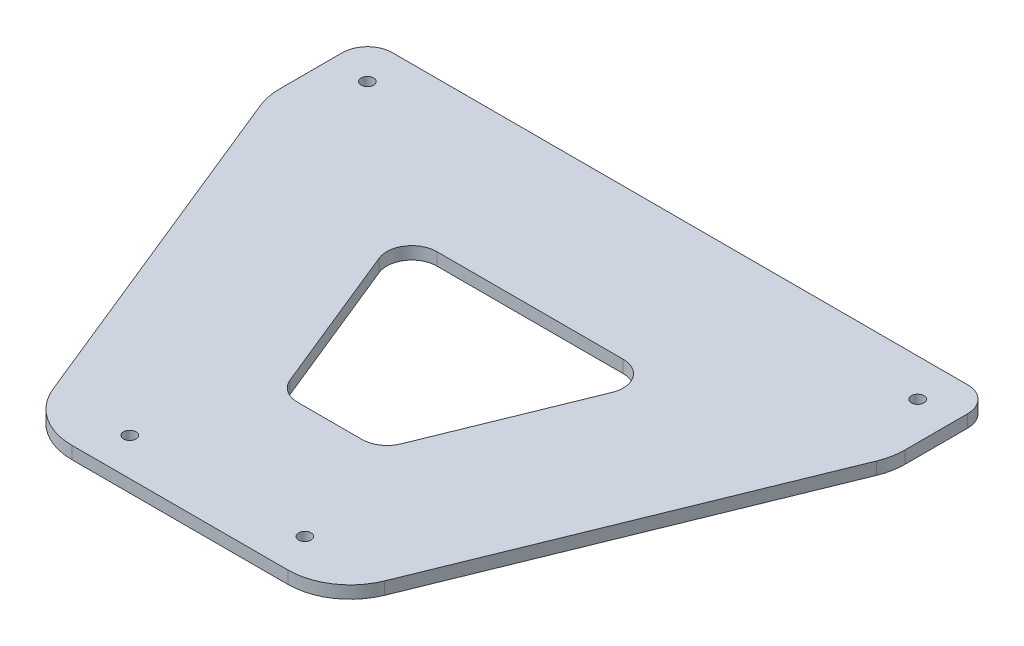
ISO-10303-21;
HEADER;
FILE_DESCRIPTION(('STEP AP214'),'2;1');
FILE_NAME('part.step','',(''),(''),'','','');
FILE_SCHEMA(('AUTOMOTIVE_DESIGN { 1 0 10303 214 1 1 1 1 }'));
ENDSEC;
DATA;
#1=APPLICATION_CONTEXT('core data for automotive mechanical design processes');
#2=APPLICATION_PROTOCOL_DEFINITION('international standard','automotive_design',2000,#1);
#3=PRODUCT_CONTEXT('',#1,'mechanical');
#4=PRODUCT('Part','Part','',(#3));
#5=PRODUCT_RELATED_PRODUCT_CATEGORY('part','',(#4));
#6=PRODUCT_DEFINITION_FORMATION('','',#4);
#7=PRODUCT_DEFINITION_CONTEXT('part definition',#1,'design');
#8=PRODUCT_DEFINITION('design','',#6,#7);
#9=PRODUCT_DEFINITION_SHAPE('','',#8);
#10=(LENGTH_UNIT() NAMED_UNIT(*) SI_UNIT(.MILLI.,.METRE.));
#11=(NAMED_UNIT(*) PLANE_ANGLE_UNIT() SI_UNIT($,.RADIAN.));
#12=(NAMED_UNIT(*) SI_UNIT($,.STERADIAN.) SOLID_ANGLE_UNIT());
#13=UNCERTAINTY_MEASURE_WITH_UNIT(LENGTH_MEASURE(1.E-05),#10,'distance_accuracy_value','');
#14=(GEOMETRIC_REPRESENTATION_CONTEXT(3) GLOBAL_UNCERTAINTY_ASSIGNED_CONTEXT((#13)) GLOBAL_UNIT_ASSIGNED_CONTEXT((#10,
#11,#12)) REPRESENTATION_CONTEXT('',''));
#15=CARTESIAN_POINT('',(0.,0.,0.));
#16=DIRECTION('',(0.,0.,1.));
#17=DIRECTION('',(1.,0.,0.));
#18=AXIS2_PLACEMENT_3D('',#15,#16,#17);
#19=CARTESIAN_POINT('',(-75.,5.,-64.8842924583482));
#20=DIRECTION('',(0.,-1.,0.));
#21=DIRECTION('',(0.,0.,-1.));
#22=AXIS2_PLACEMENT_3D('',#19,#20,#21);
#23=CYLINDRICAL_SURFACE('',#22,25.);
#24=CARTESIAN_POINT('',(-75.,0.,-64.8842924583482));
#25=DIRECTION('',(0.,1.,0.));
#26=DIRECTION('',(0.,0.,1.));
#27=AXIS2_PLACEMENT_3D('',#24,#25,#26);
#28=CIRCLE('',#27,25.);
#29=CARTESIAN_POINT('',(-100.,0.,-64.8842924583483));
#30=VERTEX_POINT('',#29);
#31=CARTESIAN_POINT('',(-98.1616644280577,0.,-55.4748662844496));
#32=VERTEX_POINT('',#31);
#33=EDGE_CURVE('E245',#30,#32,#28,.T.);
#34=ORIENTED_EDGE('',*,*,#33,.T.);
#35=DIRECTION('',(0.,-1.,0.));
#36=VECTOR('',#35,1.);
#37=CARTESIAN_POINT('',(-98.1616644280577,5.,-55.4748662844496));
#38=LINE('',#37,#36);
#39=CARTESIAN_POINT('',(-98.1616644280577,5.,-55.4748662844496));
#40=VERTEX_POINT('',#39);
#41=EDGE_CURVE('E390',#40,#32,#38,.T.);
#42=ORIENTED_EDGE('',*,*,#41,.F.);
#43=CARTESIAN_POINT('',(-75.,5.,-64.8842924583482));
#44=DIRECTION('',(0.,1.,0.));
#45=DIRECTION('',(0.,0.,1.));
#46=AXIS2_PLACEMENT_3D('',#43,#44,#45);
#47=CIRCLE('',#46,25.);
#48=CARTESIAN_POINT('',(-100.,5.,-64.8842924583483));
#49=VERTEX_POINT('',#48);
#50=EDGE_CURVE('E273',#49,#40,#47,.T.);
#51=ORIENTED_EDGE('',*,*,#50,.F.);
#52=DIRECTION('',(0.,-1.,0.));
#53=VECTOR('',#52,1.);
#54=CARTESIAN_POINT('',(-100.,5.,-64.8842924583483));
#55=LINE('',#54,#53);
#56=EDGE_CURVE('E311',#49,#30,#55,.T.);
#57=ORIENTED_EDGE('',*,*,#56,.T.);
#58=EDGE_LOOP('',(#34,#42,#51,#57));
#59=FACE_BOUND('',#58,.T.);
#60=ADVANCED_FACE('F39',(#59),#23,.T.);
#61=CARTESIAN_POINT('',(-41.3336706168538,5.,84.4094261738983));
#62=DIRECTION('',(0.926466577122309,0.,-0.376377046955938));
#63=DIRECTION('',(-0.376377046955938,0.,-0.926466577122309));
#64=AXIS2_PLACEMENT_3D('',#61,#62,#63);
#65=PLANE('',#64);
#66=DIRECTION('',(0.376377046955938,0.,0.926466577122309));
#67=VECTOR('',#66,1.);
#68=CARTESIAN_POINT('',(-41.3336706168538,0.,84.4094261738983));
#69=LINE('',#68,#67);
#70=CARTESIAN_POINT('',(-41.3336706168538,0.,84.4094261738984));
#71=VERTEX_POINT('',#70);
#72=EDGE_CURVE('E315',#32,#71,#69,.T.);
#73=ORIENTED_EDGE('',*,*,#72,.T.);
#74=DIRECTION('',(0.,-1.,0.));
#75=VECTOR('',#74,1.);
#76=CARTESIAN_POINT('',(-41.3336706168538,5.,84.4094261738984));
#77=LINE('',#76,#75);
#78=CARTESIAN_POINT('',(-41.3336706168538,5.,84.4094261738984));
#79=VERTEX_POINT('',#78);
#80=EDGE_CURVE('E386',#79,#71,#77,.T.);
#81=ORIENTED_EDGE('',*,*,#80,.F.);
#82=DIRECTION('',(0.376377046955938,0.,0.926466577122309));
#83=VECTOR('',#82,1.);
#84=CARTESIAN_POINT('',(-41.3336706168538,5.,84.4094261738983));
#85=LINE('',#84,#83);
#86=EDGE_CURVE('E277',#40,#79,#85,.T.);
#87=ORIENTED_EDGE('',*,*,#86,.F.);
#88=ORIENTED_EDGE('',*,*,#41,.T.);
#89=EDGE_LOOP('',(#73,#81,#87,#88));
#90=FACE_BOUND('',#89,.T.);
#91=ADVANCED_FACE('F452',(#90),#65,.F.);
#92=CARTESIAN_POINT('',(-18.1720061887961,5.,75.));
#93=DIRECTION('',(0.,-1.,0.));
#94=DIRECTION('',(0.,0.,-1.));
#95=AXIS2_PLACEMENT_3D('',#92,#93,#94);
#96=CYLINDRICAL_SURFACE('',#95,25.);
#97=CARTESIAN_POINT('',(-18.1720061887961,0.,75.));
#98=DIRECTION('',(0.,1.,0.));
#99=DIRECTION('',(0.,0.,-1.));
#100=AXIS2_PLACEMENT_3D('',#97,#98,#99);
#101=CIRCLE('',#100,25.);
#102=CARTESIAN_POINT('',(-18.1720061887959,0.,100.));
#103=VERTEX_POINT('',#102);
#104=EDGE_CURVE('E318',#71,#103,#101,.T.);
#105=ORIENTED_EDGE('',*,*,#104,.T.);
#106=DIRECTION('',(0.,-1.,0.));
#107=VECTOR('',#106,1.);
#108=CARTESIAN_POINT('',(-18.1720061887959,5.,100.));
#109=LINE('',#108,#107);
#110=CARTESIAN_POINT('',(-18.1720061887959,5.,100.));
#111=VERTEX_POINT('',#110);
#112=EDGE_CURVE('E382',#111,#103,#109,.T.);
#113=ORIENTED_EDGE('',*,*,#112,.F.);
#114=CARTESIAN_POINT('',(-18.1720061887961,5.,75.));
#115=DIRECTION('',(0.,1.,0.));
#116=DIRECTION('',(0.,0.,-1.));
#117=AXIS2_PLACEMENT_3D('',#114,#115,#116);
#118=CIRCLE('',#117,25.);
#119=EDGE_CURVE('E281',#79,#111,#118,.T.);
#120=ORIENTED_EDGE('',*,*,#119,.F.);
#121=ORIENTED_EDGE('',*,*,#80,.T.);
#122=EDGE_LOOP('',(#105,#113,#120,#121));
#123=FACE_BOUND('',#122,.T.);
#124=ADVANCED_FACE('F457',(#123),#96,.T.);
#125=CARTESIAN_POINT('',(68.1720061887959,5.,100.));
#126=DIRECTION('',(0.,0.,-1.));
#127=DIRECTION('',(-1.,0.,0.));
#128=AXIS2_PLACEMENT_3D('',#125,#126,#127);
#129=PLANE('',#128);
#130=DIRECTION('',(1.,0.,0.));
#131=VECTOR('',#130,1.);
#132=CARTESIAN_POINT('',(68.1720061887959,0.,100.));
#133=LINE('',#132,#131);
#134=CARTESIAN_POINT('',(68.1720061887959,0.,100.));
#135=VERTEX_POINT('',#134);
#136=EDGE_CURVE('E321',#103,#135,#133,.T.);
#137=ORIENTED_EDGE('',*,*,#136,.T.);
#138=DIRECTION('',(0.,-1.,0.));
#139=VECTOR('',#138,1.);
#140=CARTESIAN_POINT('',(68.1720061887959,5.,100.));
#141=LINE('',#140,#139);
#142=CARTESIAN_POINT('',(68.1720061887959,5.,100.));
#143=VERTEX_POINT('',#142);
#144=EDGE_CURVE('E378',#143,#135,#141,.T.);
#145=ORIENTED_EDGE('',*,*,#144,.F.);
#146=DIRECTION('',(1.,0.,0.));
#147=VECTOR('',#146,1.);
#148=CARTESIAN_POINT('',(68.1720061887959,5.,100.));
#149=LINE('',#148,#147);
#150=EDGE_CURVE('E284',#111,#143,#149,.T.);
#151=ORIENTED_EDGE('',*,*,#150,.F.);
#152=ORIENTED_EDGE('',*,*,#112,.T.);
#153=EDGE_LOOP('',(#137,#145,#151,#152));
#154=FACE_BOUND('',#153,.T.);
#155=ADVANCED_FACE('F510',(#154),#129,.F.);
#156=CARTESIAN_POINT('',(68.172006188796,5.,75.));
#157=DIRECTION('',(0.,-1.,0.));
#158=DIRECTION('',(0.,0.,-1.));
#159=AXIS2_PLACEMENT_3D('',#156,#157,#158);
#160=CYLINDRICAL_SURFACE('',#159,25.);
#161=CARTESIAN_POINT('',(68.172006188796,0.,75.));
#162=DIRECTION('',(0.,1.,0.));
#163=DIRECTION('',(0.,0.,-1.));
#164=AXIS2_PLACEMENT_3D('',#161,#162,#163);
#165=CIRCLE('',#164,25.);
#166=CARTESIAN_POINT('',(91.3336706168538,0.,84.4094261738983));
#167=VERTEX_POINT('',#166);
#168=EDGE_CURVE('E324',#135,#167,#165,.T.);
#169=ORIENTED_EDGE('',*,*,#168,.T.);
#170=DIRECTION('',(0.,-1.,0.));
#171=VECTOR('',#170,1.);
#172=CARTESIAN_POINT('',(91.3336706168538,5.,84.4094261738983));
#173=LINE('',#172,#171);
#174=CARTESIAN_POINT('',(91.3336706168538,5.,84.4094261738983));
#175=VERTEX_POINT('',#174);
#176=EDGE_CURVE('E374',#175,#167,#173,.T.);
#177=ORIENTED_EDGE('',*,*,#176,.F.);
#178=CARTESIAN_POINT('',(68.172006188796,5.,75.));
#179=DIRECTION('',(0.,1.,0.));
#180=DIRECTION('',(0.,0.,-1.));
#181=AXIS2_PLACEMENT_3D('',#178,#179,#180);
#182=CIRCLE('',#181,25.);
#183=EDGE_CURVE('E287',#143,#175,#182,.T.);
#184=ORIENTED_EDGE('',*,*,#183,.F.);
#185=ORIENTED_EDGE('',*,*,#144,.T.);
#186=EDGE_LOOP('',(#169,#177,#184,#185));
#187=FACE_BOUND('',#186,.T.);
#188=ADVANCED_FACE('F507',(#187),#160,.T.);
#189=CARTESIAN_POINT('',(91.3336706168538,5.,84.4094261738983));
#190=DIRECTION('',(-0.926466577122309,0.,-0.376377046955939));
#191=DIRECTION('',(-0.376377046955939,0.,0.926466577122309));
#192=AXIS2_PLACEMENT_3D('',#189,#190,#191);
#193=PLANE('',#192);
#194=DIRECTION('',(0.376377046955939,0.,-0.926466577122309));
#195=VECTOR('',#194,1.);
#196=CARTESIAN_POINT('',(91.3336706168538,0.,84.4094261738983));
#197=LINE('',#196,#195);
#198=CARTESIAN_POINT('',(148.161664428058,0.,-55.4748662844496));
#199=VERTEX_POINT('',#198);
#200=EDGE_CURVE('E327',#167,#199,#197,.T.);
#201=ORIENTED_EDGE('',*,*,#200,.T.);
#202=DIRECTION('',(0.,-1.,0.));
#203=VECTOR('',#202,1.);
#204=CARTESIAN_POINT('',(148.161664428058,5.,-55.4748662844496));
#205=LINE('',#204,#203);
#206=CARTESIAN_POINT('',(148.161664428058,5.,-55.4748662844496));
#207=VERTEX_POINT('',#206);
#208=EDGE_CURVE('E370',#207,#199,#205,.T.);
#209=ORIENTED_EDGE('',*,*,#208,.F.);
#210=DIRECTION('',(0.376377046955939,0.,-0.926466577122309));
#211=VECTOR('',#210,1.);
#212=CARTESIAN_POINT('',(91.3336706168538,5.,84.4094261738983));
#213=LINE('',#212,#211);
#214=EDGE_CURVE('E290',#175,#207,#213,.T.);
#215=ORIENTED_EDGE('',*,*,#214,.F.);
#216=ORIENTED_EDGE('',*,*,#176,.T.);
#217=EDGE_LOOP('',(#201,#209,#215,#216));
#218=FACE_BOUND('',#217,.T.);
#219=ADVANCED_FACE('F503',(#218),#193,.F.);
#220=CARTESIAN_POINT('',(125.,5.,-64.8842924583481));
#221=DIRECTION('',(0.,-1.,0.));
#222=DIRECTION('',(0.,0.,-1.));
#223=AXIS2_PLACEMENT_3D('',#220,#221,#222);
#224=CYLINDRICAL_SURFACE('',#223,25.);
#225=CARTESIAN_POINT('',(125.,0.,-64.8842924583481));
#226=DIRECTION('',(0.,1.,0.));
#227=DIRECTION('',(0.,0.,-1.));
#228=AXIS2_PLACEMENT_3D('',#225,#226,#227);
#229=CIRCLE('',#228,25.);
#230=CARTESIAN_POINT('',(150.,0.,-64.8842924583483));
#231=VERTEX_POINT('',#230);
#232=EDGE_CURVE('E330',#199,#231,#229,.T.);
#233=ORIENTED_EDGE('',*,*,#232,.T.);
#234=DIRECTION('',(0.,-1.,0.));
#235=VECTOR('',#234,1.);
#236=CARTESIAN_POINT('',(150.,5.,-64.8842924583483));
#237=LINE('',#236,#235);
#238=CARTESIAN_POINT('',(150.,5.,-64.8842924583483));
#239=VERTEX_POINT('',#238);
#240=EDGE_CURVE('E366',#239,#231,#237,.T.);
#241=ORIENTED_EDGE('',*,*,#240,.F.);
#242=CARTESIAN_POINT('',(125.,5.,-64.8842924583481));
#243=DIRECTION('',(0.,1.,0.));
#244=DIRECTION('',(0.,0.,-1.));
#245=AXIS2_PLACEMENT_3D('',#242,#243,#244);
#246=CIRCLE('',#245,25.);
#247=EDGE_CURVE('E293',#207,#239,#246,.T.);
#248=ORIENTED_EDGE('',*,*,#247,.F.);
#249=ORIENTED_EDGE('',*,*,#208,.T.);
#250=EDGE_LOOP('',(#233,#241,#248,#249));
#251=FACE_BOUND('',#250,.T.);
#252=ADVANCED_FACE('F498',(#251),#224,.T.);
#253=CARTESIAN_POINT('',(150.,5.,-64.8842924583483));
#254=DIRECTION('',(-1.,0.,0.));
#255=DIRECTION('',(0.,0.,1.));
#256=AXIS2_PLACEMENT_3D('',#253,#254,#255);
#257=PLANE('',#256);
#258=DIRECTION('',(0.,0.,-1.));
#259=VECTOR('',#258,1.);
#260=CARTESIAN_POINT('',(150.,0.,-64.8842924583483));
#261=LINE('',#260,#259);
#262=CARTESIAN_POINT('',(150.,0.,-90.));
#263=VERTEX_POINT('',#262);
#264=EDGE_CURVE('E333',#231,#263,#261,.T.);
#265=ORIENTED_EDGE('',*,*,#264,.T.);
#266=DIRECTION('',(0.,-1.,0.));
#267=VECTOR('',#266,1.);
#268=CARTESIAN_POINT('',(150.,5.,-90.));
#269=LINE('',#268,#267);
#270=CARTESIAN_POINT('',(150.,5.,-90.));
#271=VERTEX_POINT('',#270);
#272=EDGE_CURVE('E362',#271,#263,#269,.T.);
#273=ORIENTED_EDGE('',*,*,#272,.F.);
#274=DIRECTION('',(0.,0.,-1.));
#275=VECTOR('',#274,1.);
#276=CARTESIAN_POINT('',(150.,5.,-64.8842924583483));
#277=LINE('',#276,#275);
#278=EDGE_CURVE('E296',#239,#271,#277,.T.);
#279=ORIENTED_EDGE('',*,*,#278,.F.);
#280=ORIENTED_EDGE('',*,*,#240,.T.);
#281=EDGE_LOOP('',(#265,#273,#279,#280));
#282=FACE_BOUND('',#281,.T.);
#283=ADVANCED_FACE('F492',(#282),#257,.F.);
#284=CARTESIAN_POINT('',(140.,5.,-90.));
#285=DIRECTION('',(0.,-1.,0.));
#286=DIRECTION('',(0.,0.,-1.));
#287=AXIS2_PLACEMENT_3D('',#284,#285,#286);
#288=CYLINDRICAL_SURFACE('',#287,10.);
#289=CARTESIAN_POINT('',(140.,0.,-90.));
#290=DIRECTION('',(0.,1.,0.));
#291=DIRECTION('',(0.,0.,1.));
#292=AXIS2_PLACEMENT_3D('',#289,#290,#291);
#293=CIRCLE('',#292,10.);
#294=CARTESIAN_POINT('',(140.,0.,-100.));
#295=VERTEX_POINT('',#294);
#296=EDGE_CURVE('E336',#263,#295,#293,.T.);
#297=ORIENTED_EDGE('',*,*,#296,.T.);
#298=DIRECTION('',(0.,-1.,0.));
#299=VECTOR('',#298,1.);
#300=CARTESIAN_POINT('',(140.,5.,-100.));
#301=LINE('',#300,#299);
#302=CARTESIAN_POINT('',(140.,5.,-100.));
#303=VERTEX_POINT('',#302);
#304=EDGE_CURVE('E358',#303,#295,#301,.T.);
#305=ORIENTED_EDGE('',*,*,#304,.F.);
#306=CARTESIAN_POINT('',(140.,5.,-90.));
#307=DIRECTION('',(0.,1.,0.));
#308=DIRECTION('',(0.,0.,1.));
#309=AXIS2_PLACEMENT_3D('',#306,#307,#308);
#310=CIRCLE('',#309,10.);
#311=EDGE_CURVE('E299',#271,#303,#310,.T.);
#312=ORIENTED_EDGE('',*,*,#311,.F.);
#313=ORIENTED_EDGE('',*,*,#272,.T.);
#314=EDGE_LOOP('',(#297,#305,#312,#313));
#315=FACE_BOUND('',#314,.T.);
#316=ADVANCED_FACE('F488',(#315),#288,.T.);
#317=CARTESIAN_POINT('',(140.,5.,-100.));
#318=DIRECTION('',(0.,0.,1.));
#319=DIRECTION('',(1.,0.,0.));
#320=AXIS2_PLACEMENT_3D('',#317,#318,#319);
#321=PLANE('',#320);
#322=DIRECTION('',(-1.,0.,0.));
#323=VECTOR('',#322,1.);
#324=CARTESIAN_POINT('',(140.,0.,-100.));
#325=LINE('',#324,#323);
#326=CARTESIAN_POINT('',(-90.,0.,-100.));
#327=VERTEX_POINT('',#326);
#328=EDGE_CURVE('E339',#295,#327,#325,.T.);
#329=ORIENTED_EDGE('',*,*,#328,.T.);
#330=DIRECTION('',(0.,-1.,0.));
#331=VECTOR('',#330,1.);
#332=CARTESIAN_POINT('',(-90.,5.,-100.));
#333=LINE('',#332,#331);
#334=CARTESIAN_POINT('',(-90.,5.,-100.));
#335=VERTEX_POINT('',#334);
#336=EDGE_CURVE('E354',#335,#327,#333,.T.);
#337=ORIENTED_EDGE('',*,*,#336,.F.);
#338=DIRECTION('',(-1.,0.,0.));
#339=VECTOR('',#338,1.);
#340=CARTESIAN_POINT('',(140.,5.,-100.));
#341=LINE('',#340,#339);
#342=EDGE_CURVE('E302',#303,#335,#341,.T.);
#343=ORIENTED_EDGE('',*,*,#342,.F.);
#344=ORIENTED_EDGE('',*,*,#304,.T.);
#345=EDGE_LOOP('',(#329,#337,#343,#344));
#346=FACE_BOUND('',#345,.T.);
#347=ADVANCED_FACE('F483',(#346),#321,.F.);
#348=CARTESIAN_POINT('',(-90.,5.,-90.));
#349=DIRECTION('',(0.,-1.,0.));
#350=DIRECTION('',(0.,0.,-1.));
#351=AXIS2_PLACEMENT_3D('',#348,#349,#350);
#352=CYLINDRICAL_SURFACE('',#351,10.);
#353=CARTESIAN_POINT('',(-90.,0.,-90.));
#354=DIRECTION('',(0.,1.,0.));
#355=DIRECTION('',(0.,0.,1.));
#356=AXIS2_PLACEMENT_3D('',#353,#354,#355);
#357=CIRCLE('',#356,10.);
#358=CARTESIAN_POINT('',(-100.,0.,-90.));
#359=VERTEX_POINT('',#358);
#360=EDGE_CURVE('E342',#327,#359,#357,.T.);
#361=ORIENTED_EDGE('',*,*,#360,.T.);
#362=DIRECTION('',(0.,-1.,0.));
#363=VECTOR('',#362,1.);
#364=CARTESIAN_POINT('',(-100.,5.,-90.));
#365=LINE('',#364,#363);
#366=CARTESIAN_POINT('',(-100.,5.,-90.));
#367=VERTEX_POINT('',#366);
#368=EDGE_CURVE('E350',#367,#359,#365,.T.);
#369=ORIENTED_EDGE('',*,*,#368,.F.);
#370=CARTESIAN_POINT('',(-90.,5.,-90.));
#371=DIRECTION('',(0.,1.,0.));
#372=DIRECTION('',(0.,0.,1.));
#373=AXIS2_PLACEMENT_3D('',#370,#371,#372);
#374=CIRCLE('',#373,10.);
#375=EDGE_CURVE('E305',#335,#367,#374,.T.);
#376=ORIENTED_EDGE('',*,*,#375,.F.);
#377=ORIENTED_EDGE('',*,*,#336,.T.);
#378=EDGE_LOOP('',(#361,#369,#376,#377));
#379=FACE_BOUND('',#378,.T.);
#380=ADVANCED_FACE('F477',(#379),#352,.T.);
#381=CARTESIAN_POINT('',(-100.,5.,-64.8842924583483));
#382=DIRECTION('',(1.,0.,0.));
#383=DIRECTION('',(0.,0.,-1.));
#384=AXIS2_PLACEMENT_3D('',#381,#382,#383);
#385=PLANE('',#384);
#386=DIRECTION('',(0.,0.,1.));
#387=VECTOR('',#386,1.);
#388=CARTESIAN_POINT('',(-100.,0.,-64.8842924583483));
#389=LINE('',#388,#387);
#390=EDGE_CURVE('E278',#359,#30,#389,.T.);
#391=ORIENTED_EDGE('',*,*,#390,.T.);
#392=ORIENTED_EDGE('',*,*,#56,.F.);
#393=DIRECTION('',(0.,0.,1.));
#394=VECTOR('',#393,1.);
#395=CARTESIAN_POINT('',(-100.,5.,-64.8842924583483));
#396=LINE('',#395,#394);
#397=EDGE_CURVE('E308',#367,#49,#396,.T.);
#398=ORIENTED_EDGE('',*,*,#397,.F.);
#399=ORIENTED_EDGE('',*,*,#368,.T.);
#400=EDGE_LOOP('',(#391,#392,#398,#399));
#401=FACE_BOUND('',#400,.T.);
#402=ADVANCED_FACE('F475',(#401),#385,.F.);
#403=CARTESIAN_POINT('',(-75.,5.,-64.8842924583482));
#404=DIRECTION('',(0.,1.,0.));
#405=DIRECTION('',(0.,0.,1.));
#406=AXIS2_PLACEMENT_3D('',#403,#404,#405);
#407=PLANE('',#406);
#408=DIRECTION('',(-1.,0.,0.));
#409=VECTOR('',#408,1.);
#410=CARTESIAN_POINT('',(62.2566173286288,5.,-40.));
#411=LINE('',#410,#409);
#412=CARTESIAN_POINT('',(62.2566173286288,5.,-40.));
#413=VERTEX_POINT('',#412);
#414=CARTESIAN_POINT('',(-12.2566173286288,5.,-40.));
#415=VERTEX_POINT('',#414);
#416=EDGE_CURVE('E54',#413,#415,#411,.T.);
#417=ORIENTED_EDGE('',*,*,#416,.F.);
#418=CARTESIAN_POINT('',(62.2566173286289,5.,-30.));
#419=DIRECTION('',(0.,-1.,0.));
#420=DIRECTION('',(0.,0.,-1.));
#421=AXIS2_PLACEMENT_3D('',#418,#419,#420);
#422=CIRCLE('',#421,10.);
#423=CARTESIAN_POINT('',(71.521283099852,5.,-26.2362295304405));
#424=VERTEX_POINT('',#423);
#425=EDGE_CURVE('E217',#413,#424,#422,.T.);
#426=ORIENTED_EDGE('',*,*,#425,.T.);
#427=DIRECTION('',(0.376377046955938,0.,-0.926466577122309));
#428=VECTOR('',#427,1.);
#429=CARTESIAN_POINT('',(47.146283099852,5.,33.7637704695593));
#430=LINE('',#429,#428);
#431=CARTESIAN_POINT('',(47.146283099852,5.,33.7637704695593));
#432=VERTEX_POINT('',#431);
#433=EDGE_CURVE('E213',#432,#424,#430,.T.);
#434=ORIENTED_EDGE('',*,*,#433,.F.);
#435=CARTESIAN_POINT('',(37.8816173286289,5.,30.));
#436=DIRECTION('',(0.,-1.,0.));
#437=DIRECTION('',(0.,0.,-1.));
#438=AXIS2_PLACEMENT_3D('',#435,#436,#437);
#439=CIRCLE('',#438,10.);
#440=CARTESIAN_POINT('',(37.8816173286288,5.,40.));
#441=VERTEX_POINT('',#440);
#442=EDGE_CURVE('E209',#432,#441,#439,.T.);
#443=ORIENTED_EDGE('',*,*,#442,.T.);
#444=DIRECTION('',(1.,0.,0.));
#445=VECTOR('',#444,1.);
#446=CARTESIAN_POINT('',(12.1183826713711,5.,40.));
#447=LINE('',#446,#445);
#448=CARTESIAN_POINT('',(12.1183826713711,5.,40.));
#449=VERTEX_POINT('',#448);
#450=EDGE_CURVE('E202',#449,#441,#447,.T.);
#451=ORIENTED_EDGE('',*,*,#450,.F.);
#452=CARTESIAN_POINT('',(12.1183826713711,5.,30.));
#453=DIRECTION('',(0.,1.,0.));
#454=DIRECTION('',(0.,0.,1.));
#455=AXIS2_PLACEMENT_3D('',#452,#453,#454);
#456=CIRCLE('',#455,10.);
#457=CARTESIAN_POINT('',(2.85371690014798,5.,33.7637704695593));
#458=VERTEX_POINT('',#457);
#459=EDGE_CURVE('E198',#458,#449,#456,.T.);
#460=ORIENTED_EDGE('',*,*,#459,.F.);
#461=DIRECTION('',(0.376377046955938,0.,0.926466577122309));
#462=VECTOR('',#461,1.);
#463=CARTESIAN_POINT('',(-21.521283099852,5.,-26.2362295304405));
#464=LINE('',#463,#462);
#465=CARTESIAN_POINT('',(-21.521283099852,5.,-26.2362295304405));
#466=VERTEX_POINT('',#465);
#467=EDGE_CURVE('E179',#466,#458,#464,.T.);
#468=ORIENTED_EDGE('',*,*,#467,.F.);
#469=CARTESIAN_POINT('',(-12.2566173286289,5.,-30.));
#470=DIRECTION('',(0.,1.,0.));
#471=DIRECTION('',(0.,0.,1.));
#472=AXIS2_PLACEMENT_3D('',#469,#470,#471);
#473=CIRCLE('',#472,9.99999999999999);
#474=EDGE_CURVE('E189',#415,#466,#473,.T.);
#475=ORIENTED_EDGE('',*,*,#474,.F.);
#476=EDGE_LOOP('',(#417,#426,#434,#443,#451,#460,#468,#475));
#477=FACE_BOUND('',#476,.T.);
#478=CARTESIAN_POINT('',(135.,5.,-85.));
#479=DIRECTION('',(0.,1.,0.));
#480=DIRECTION('',(0.,0.,1.));
#481=AXIS2_PLACEMENT_3D('',#478,#479,#480);
#482=CIRCLE('',#481,2.5);
#483=CARTESIAN_POINT('',(135.,5.,-82.5));
#484=VERTEX_POINT('',#483);
#485=EDGE_CURVE('E246',#484,#484,#482,.T.);
#486=ORIENTED_EDGE('',*,*,#485,.F.);
#487=EDGE_LOOP('',(#486));
#488=FACE_BOUND('',#487,.T.);
#489=CARTESIAN_POINT('',(-85.,5.,-85.));
#490=DIRECTION('',(0.,1.,0.));
#491=DIRECTION('',(0.,0.,1.));
#492=AXIS2_PLACEMENT_3D('',#489,#490,#491);
#493=CIRCLE('',#492,2.50000000000001);
#494=CARTESIAN_POINT('',(-85.,5.,-82.5));
#495=VERTEX_POINT('',#494);
#496=EDGE_CURVE('E254',#495,#495,#493,.T.);
#497=ORIENTED_EDGE('',*,*,#496,.F.);
#498=EDGE_LOOP('',(#497));
#499=FACE_BOUND('',#498,.T.);
#500=CARTESIAN_POINT('',(-10.,5.,85.));
#501=DIRECTION('',(0.,1.,0.));
#502=DIRECTION('',(0.,0.,1.));
#503=AXIS2_PLACEMENT_3D('',#500,#501,#502);
#504=CIRCLE('',#503,2.50000000000001);
#505=CARTESIAN_POINT('',(-10.,5.,87.5));
#506=VERTEX_POINT('',#505);
#507=EDGE_CURVE('E262',#506,#506,#504,.T.);
#508=ORIENTED_EDGE('',*,*,#507,.F.);
#509=EDGE_LOOP('',(#508));
#510=FACE_BOUND('',#509,.T.);
#511=CARTESIAN_POINT('',(60.,5.,85.));
#512=DIRECTION('',(0.,1.,0.));
#513=DIRECTION('',(0.,0.,1.));
#514=AXIS2_PLACEMENT_3D('',#511,#512,#513);
#515=CIRCLE('',#514,2.5);
#516=CARTESIAN_POINT('',(60.,5.,87.5));
#517=VERTEX_POINT('',#516);
#518=EDGE_CURVE('E224',#517,#517,#515,.T.);
#519=ORIENTED_EDGE('',*,*,#518,.F.);
#520=EDGE_LOOP('',(#519));
#521=FACE_BOUND('',#520,.T.);
#522=ORIENTED_EDGE('',*,*,#50,.T.);
#523=ORIENTED_EDGE('',*,*,#86,.T.);
#524=ORIENTED_EDGE('',*,*,#119,.T.);
#525=ORIENTED_EDGE('',*,*,#150,.T.);
#526=ORIENTED_EDGE('',*,*,#183,.T.);
#527=ORIENTED_EDGE('',*,*,#214,.T.);
#528=ORIENTED_EDGE('',*,*,#247,.T.);
#529=ORIENTED_EDGE('',*,*,#278,.T.);
#530=ORIENTED_EDGE('',*,*,#311,.T.);
#531=ORIENTED_EDGE('',*,*,#342,.T.);
#532=ORIENTED_EDGE('',*,*,#375,.T.);
#533=ORIENTED_EDGE('',*,*,#397,.T.);
#534=EDGE_LOOP('',(#522,#523,#524,#525,#526,#527,#528,#529,#530,#531,#532,#533));
#535=FACE_BOUND('',#534,.T.);
#536=ADVANCED_FACE('F194',(#477,#488,#499,#510,#521,#535),#407,.T.);
#537=CARTESIAN_POINT('',(-75.,0.,-64.8842924583482));
#538=DIRECTION('',(0.,1.,0.));
#539=DIRECTION('',(0.,0.,1.));
#540=AXIS2_PLACEMENT_3D('',#537,#538,#539);
#541=PLANE('',#540);
#542=CARTESIAN_POINT('',(62.2566173286289,0.,-30.));
#543=DIRECTION('',(0.,1.,0.));
#544=DIRECTION('',(0.,0.,1.));
#545=AXIS2_PLACEMENT_3D('',#542,#543,#544);
#546=CIRCLE('',#545,10.);
#547=CARTESIAN_POINT('',(62.2566173286288,0.,-40.));
#548=VERTEX_POINT('',#547);
#549=CARTESIAN_POINT('',(71.521283099852,0.,-26.2362295304405));
#550=VERTEX_POINT('',#549);
#551=EDGE_CURVE('E47',#548,#550,#546,.F.);
#552=ORIENTED_EDGE('',*,*,#551,.F.);
#553=DIRECTION('',(-1.,0.,0.));
#554=VECTOR('',#553,1.);
#555=CARTESIAN_POINT('',(-75.,0.,-40.));
#556=LINE('',#555,#554);
#557=CARTESIAN_POINT('',(-12.2566173286288,0.,-40.));
#558=VERTEX_POINT('',#557);
#559=EDGE_CURVE('E11',#548,#558,#556,.T.);
#560=ORIENTED_EDGE('',*,*,#559,.T.);
#561=CARTESIAN_POINT('',(-12.2566173286289,0.,-30.));
#562=DIRECTION('',(0.,1.,0.));
#563=DIRECTION('',(0.,0.,1.));
#564=AXIS2_PLACEMENT_3D('',#561,#562,#563);
#565=CIRCLE('',#564,9.99999999999999);
#566=CARTESIAN_POINT('',(-21.521283099852,0.,-26.2362295304405));
#567=VERTEX_POINT('',#566);
#568=EDGE_CURVE('E394',#558,#567,#565,.T.);
#569=ORIENTED_EDGE('',*,*,#568,.T.);
#570=DIRECTION('',(0.376377046955938,0.,0.926466577122309));
#571=VECTOR('',#570,1.);
#572=CARTESIAN_POINT('',(-42.5736698007192,0.,-78.057489101806));
#573=LINE('',#572,#571);
#574=CARTESIAN_POINT('',(2.85371690014798,0.,33.7637704695593));
#575=VERTEX_POINT('',#574);
#576=EDGE_CURVE('E182',#567,#575,#573,.T.);
#577=ORIENTED_EDGE('',*,*,#576,.T.);
#578=CARTESIAN_POINT('',(12.1183826713711,0.,30.));
#579=DIRECTION('',(0.,1.,0.));
#580=DIRECTION('',(0.,0.,1.));
#581=AXIS2_PLACEMENT_3D('',#578,#579,#580);
#582=CIRCLE('',#581,10.);
#583=CARTESIAN_POINT('',(12.1183826713711,0.,40.));
#584=VERTEX_POINT('',#583);
#585=EDGE_CURVE('E399',#575,#584,#582,.T.);
#586=ORIENTED_EDGE('',*,*,#585,.T.);
#587=DIRECTION('',(1.,0.,0.));
#588=VECTOR('',#587,1.);
#589=CARTESIAN_POINT('',(-75.0000000000001,0.,40.));
#590=LINE('',#589,#588);
#591=CARTESIAN_POINT('',(37.8816173286288,0.,40.));
#592=VERTEX_POINT('',#591);
#593=EDGE_CURVE('E403',#584,#592,#590,.T.);
#594=ORIENTED_EDGE('',*,*,#593,.T.);
#595=CARTESIAN_POINT('',(37.8816173286289,0.,30.));
#596=DIRECTION('',(0.,1.,0.));
#597=DIRECTION('',(0.,0.,1.));
#598=AXIS2_PLACEMENT_3D('',#595,#596,#597);
#599=CIRCLE('',#598,10.);
#600=CARTESIAN_POINT('',(47.146283099852,0.,33.7637704695593));
#601=VERTEX_POINT('',#600);
#602=EDGE_CURVE('E407',#601,#592,#599,.F.);
#603=ORIENTED_EDGE('',*,*,#602,.F.);
#604=DIRECTION('',(0.376377046955939,0.,-0.926466577122309));
#605=VECTOR('',#604,1.);
#606=CARTESIAN_POINT('',(64.2417335056646,0.,-8.31733822167183));
#607=LINE('',#606,#605);
#608=EDGE_CURVE('E410',#601,#550,#607,.T.);
#609=ORIENTED_EDGE('',*,*,#608,.T.);
#610=EDGE_LOOP('',(#552,#560,#569,#577,#586,#594,#603,#609));
#611=FACE_BOUND('',#610,.T.);
#612=CARTESIAN_POINT('',(135.,0.,-85.));
#613=DIRECTION('',(0.,1.,0.));
#614=DIRECTION('',(0.,0.,1.));
#615=AXIS2_PLACEMENT_3D('',#612,#613,#614);
#616=CIRCLE('',#615,2.5);
#617=CARTESIAN_POINT('',(135.,0.,-82.5));
#618=VERTEX_POINT('',#617);
#619=EDGE_CURVE('E241',#618,#618,#616,.T.);
#620=ORIENTED_EDGE('',*,*,#619,.T.);
#621=EDGE_LOOP('',(#620));
#622=FACE_BOUND('',#621,.T.);
#623=CARTESIAN_POINT('',(-85.,0.,-85.));
#624=DIRECTION('',(0.,1.,0.));
#625=DIRECTION('',(0.,0.,1.));
#626=AXIS2_PLACEMENT_3D('',#623,#624,#625);
#627=CIRCLE('',#626,2.50000000000001);
#628=CARTESIAN_POINT('',(-85.,0.,-82.5));
#629=VERTEX_POINT('',#628);
#630=EDGE_CURVE('E250',#629,#629,#627,.T.);
#631=ORIENTED_EDGE('',*,*,#630,.T.);
#632=EDGE_LOOP('',(#631));
#633=FACE_BOUND('',#632,.T.);
#634=CARTESIAN_POINT('',(-10.,0.,85.));
#635=DIRECTION('',(0.,1.,0.));
#636=DIRECTION('',(0.,0.,1.));
#637=AXIS2_PLACEMENT_3D('',#634,#635,#636);
#638=CIRCLE('',#637,2.50000000000001);
#639=CARTESIAN_POINT('',(-10.,0.,87.5));
#640=VERTEX_POINT('',#639);
#641=EDGE_CURVE('E258',#640,#640,#638,.T.);
#642=ORIENTED_EDGE('',*,*,#641,.T.);
#643=EDGE_LOOP('',(#642));
#644=FACE_BOUND('',#643,.T.);
#645=CARTESIAN_POINT('',(60.,0.,85.));
#646=DIRECTION('',(0.,1.,0.));
#647=DIRECTION('',(0.,0.,1.));
#648=AXIS2_PLACEMENT_3D('',#645,#646,#647);
#649=CIRCLE('',#648,2.5);
#650=CARTESIAN_POINT('',(60.,0.,87.5));
#651=VERTEX_POINT('',#650);
#652=EDGE_CURVE('E266',#651,#651,#649,.T.);
#653=ORIENTED_EDGE('',*,*,#652,.T.);
#654=EDGE_LOOP('',(#653));
#655=FACE_BOUND('',#654,.T.);
#656=ORIENTED_EDGE('',*,*,#33,.F.);
#657=ORIENTED_EDGE('',*,*,#390,.F.);
#658=ORIENTED_EDGE('',*,*,#360,.F.);
#659=ORIENTED_EDGE('',*,*,#328,.F.);
#660=ORIENTED_EDGE('',*,*,#296,.F.);
#661=ORIENTED_EDGE('',*,*,#264,.F.);
#662=ORIENTED_EDGE('',*,*,#232,.F.);
#663=ORIENTED_EDGE('',*,*,#200,.F.);
#664=ORIENTED_EDGE('',*,*,#168,.F.);
#665=ORIENTED_EDGE('',*,*,#136,.F.);
#666=ORIENTED_EDGE('',*,*,#104,.F.);
#667=ORIENTED_EDGE('',*,*,#72,.F.);
#668=EDGE_LOOP('',(#656,#657,#658,#659,#660,#661,#662,#663,#664,#665,#666,#667));
#669=FACE_BOUND('',#668,.T.);
#670=ADVANCED_FACE('F426',(#611,#622,#633,#644,#655,#669),#541,.F.);
#671=CARTESIAN_POINT('',(60.,0.,85.));
#672=DIRECTION('',(0.,1.,0.));
#673=DIRECTION('',(0.,0.,1.));
#674=AXIS2_PLACEMENT_3D('',#671,#672,#673);
#675=CYLINDRICAL_SURFACE('',#674,2.5);
#676=ORIENTED_EDGE('',*,*,#652,.F.);
#677=EDGE_LOOP('',(#676));
#678=FACE_BOUND('',#677,.T.);
#679=ORIENTED_EDGE('',*,*,#518,.T.);
#680=EDGE_LOOP('',(#679));
#681=FACE_BOUND('',#680,.T.);
#682=ADVANCED_FACE('F539',(#678,#681),#675,.F.);
#683=CARTESIAN_POINT('',(-10.,0.,85.));
#684=DIRECTION('',(0.,1.,0.));
#685=DIRECTION('',(0.,0.,1.));
#686=AXIS2_PLACEMENT_3D('',#683,#684,#685);
#687=CYLINDRICAL_SURFACE('',#686,2.50000000000001);
#688=ORIENTED_EDGE('',*,*,#641,.F.);
#689=EDGE_LOOP('',(#688));
#690=FACE_BOUND('',#689,.T.);
#691=ORIENTED_EDGE('',*,*,#507,.T.);
#692=EDGE_LOOP('',(#691));
#693=FACE_BOUND('',#692,.T.);
#694=ADVANCED_FACE('F544',(#690,#693),#687,.F.);
#695=CARTESIAN_POINT('',(-85.,0.,-85.));
#696=DIRECTION('',(0.,1.,0.));
#697=DIRECTION('',(0.,0.,1.));
#698=AXIS2_PLACEMENT_3D('',#695,#696,#697);
#699=CYLINDRICAL_SURFACE('',#698,2.50000000000001);
#700=ORIENTED_EDGE('',*,*,#630,.F.);
#701=EDGE_LOOP('',(#700));
#702=FACE_BOUND('',#701,.T.);
#703=ORIENTED_EDGE('',*,*,#496,.T.);
#704=EDGE_LOOP('',(#703));
#705=FACE_BOUND('',#704,.T.);
#706=ADVANCED_FACE('F447',(#702,#705),#699,.F.);
#707=CARTESIAN_POINT('',(135.,0.,-85.));
#708=DIRECTION('',(0.,1.,0.));
#709=DIRECTION('',(0.,0.,1.));
#710=AXIS2_PLACEMENT_3D('',#707,#708,#709);
#711=CYLINDRICAL_SURFACE('',#710,2.5);
#712=ORIENTED_EDGE('',*,*,#619,.F.);
#713=EDGE_LOOP('',(#712));
#714=FACE_BOUND('',#713,.T.);
#715=ORIENTED_EDGE('',*,*,#485,.T.);
#716=EDGE_LOOP('',(#715));
#717=FACE_BOUND('',#716,.T.);
#718=ADVANCED_FACE('F440',(#714,#717),#711,.F.);
#719=CARTESIAN_POINT('',(62.2566173286288,-5.,-40.));
#720=DIRECTION('',(0.,0.,-1.));
#721=DIRECTION('',(-1.,0.,0.));
#722=AXIS2_PLACEMENT_3D('',#719,#720,#721);
#723=PLANE('',#722);
#724=DIRECTION('',(0.,1.,0.));
#725=VECTOR('',#724,1.);
#726=CARTESIAN_POINT('',(62.2566173286288,-5.,-40.));
#727=LINE('',#726,#725);
#728=EDGE_CURVE('E221',#548,#413,#727,.T.);
#729=ORIENTED_EDGE('',*,*,#728,.T.);
#730=ORIENTED_EDGE('',*,*,#416,.T.);
#731=DIRECTION('',(0.,1.,0.));
#732=VECTOR('',#731,1.);
#733=CARTESIAN_POINT('',(-12.2566173286288,-5.,-40.));
#734=LINE('',#733,#732);
#735=EDGE_CURVE('E186',#558,#415,#734,.T.);
#736=ORIENTED_EDGE('',*,*,#735,.F.);
#737=ORIENTED_EDGE('',*,*,#559,.F.);
#738=EDGE_LOOP('',(#729,#730,#736,#737));
#739=FACE_BOUND('',#738,.T.);
#740=ADVANCED_FACE('F438',(#739),#723,.F.);
#741=CARTESIAN_POINT('',(62.2566173286289,-5.,-30.));
#742=DIRECTION('',(0.,1.,0.));
#743=DIRECTION('',(0.,0.,1.));
#744=AXIS2_PLACEMENT_3D('',#741,#742,#743);
#745=CYLINDRICAL_SURFACE('',#744,10.);
#746=ORIENTED_EDGE('',*,*,#551,.T.);
#747=DIRECTION('',(0.,1.,0.));
#748=VECTOR('',#747,1.);
#749=CARTESIAN_POINT('',(71.521283099852,-5.,-26.2362295304405));
#750=LINE('',#749,#748);
#751=EDGE_CURVE('E225',#550,#424,#750,.T.);
#752=ORIENTED_EDGE('',*,*,#751,.T.);
#753=ORIENTED_EDGE('',*,*,#425,.F.);
#754=ORIENTED_EDGE('',*,*,#728,.F.);
#755=EDGE_LOOP('',(#746,#752,#753,#754));
#756=FACE_BOUND('',#755,.T.);
#757=ADVANCED_FACE('F418',(#756),#745,.F.);
#758=CARTESIAN_POINT('',(47.146283099852,-5.,33.7637704695593));
#759=DIRECTION('',(0.926466577122309,0.,0.376377046955938));
#760=DIRECTION('',(0.376377046955939,0.,-0.926466577122309));
#761=AXIS2_PLACEMENT_3D('',#758,#759,#760);
#762=PLANE('',#761);
#763=DIRECTION('',(0.,1.,0.));
#764=VECTOR('',#763,1.);
#765=CARTESIAN_POINT('',(47.146283099852,-5.,33.7637704695593));
#766=LINE('',#765,#764);
#767=EDGE_CURVE('E228',#601,#432,#766,.T.);
#768=ORIENTED_EDGE('',*,*,#767,.T.);
#769=ORIENTED_EDGE('',*,*,#433,.T.);
#770=ORIENTED_EDGE('',*,*,#751,.F.);
#771=ORIENTED_EDGE('',*,*,#608,.F.);
#772=EDGE_LOOP('',(#768,#769,#770,#771));
#773=FACE_BOUND('',#772,.T.);
#774=ADVANCED_FACE('F422',(#773),#762,.F.);
#775=CARTESIAN_POINT('',(37.8816173286289,-5.,30.));
#776=DIRECTION('',(0.,1.,0.));
#777=DIRECTION('',(0.,0.,1.));
#778=AXIS2_PLACEMENT_3D('',#775,#776,#777);
#779=CYLINDRICAL_SURFACE('',#778,10.);
#780=ORIENTED_EDGE('',*,*,#602,.T.);
#781=DIRECTION('',(0.,1.,0.));
#782=VECTOR('',#781,1.);
#783=CARTESIAN_POINT('',(37.8816173286288,-5.,40.));
#784=LINE('',#783,#782);
#785=EDGE_CURVE('E231',#592,#441,#784,.T.);
#786=ORIENTED_EDGE('',*,*,#785,.T.);
#787=ORIENTED_EDGE('',*,*,#442,.F.);
#788=ORIENTED_EDGE('',*,*,#767,.F.);
#789=EDGE_LOOP('',(#780,#786,#787,#788));
#790=FACE_BOUND('',#789,.T.);
#791=ADVANCED_FACE('F430',(#790),#779,.F.);
#792=CARTESIAN_POINT('',(12.1183826713711,-5.,40.));
#793=DIRECTION('',(0.,0.,1.));
#794=DIRECTION('',(1.,0.,0.));
#795=AXIS2_PLACEMENT_3D('',#792,#793,#794);
#796=PLANE('',#795);
#797=DIRECTION('',(0.,1.,0.));
#798=VECTOR('',#797,1.);
#799=CARTESIAN_POINT('',(12.1183826713711,-5.,40.));
#800=LINE('',#799,#798);
#801=EDGE_CURVE('E234',#584,#449,#800,.T.);
#802=ORIENTED_EDGE('',*,*,#801,.T.);
#803=ORIENTED_EDGE('',*,*,#450,.T.);
#804=ORIENTED_EDGE('',*,*,#785,.F.);
#805=ORIENTED_EDGE('',*,*,#593,.F.);
#806=EDGE_LOOP('',(#802,#803,#804,#805));
#807=FACE_BOUND('',#806,.T.);
#808=ADVANCED_FACE('F433',(#807),#796,.F.);
#809=CARTESIAN_POINT('',(12.1183826713711,-5.,30.));
#810=DIRECTION('',(0.,1.,0.));
#811=DIRECTION('',(0.,0.,1.));
#812=AXIS2_PLACEMENT_3D('',#809,#810,#811);
#813=CYLINDRICAL_SURFACE('',#812,10.);
#814=DIRECTION('',(0.,1.,0.));
#815=VECTOR('',#814,1.);
#816=CARTESIAN_POINT('',(2.85371690014798,-5.,33.7637704695593));
#817=LINE('',#816,#815);
#818=EDGE_CURVE('E185',#575,#458,#817,.T.);
#819=ORIENTED_EDGE('',*,*,#818,.T.);
#820=ORIENTED_EDGE('',*,*,#459,.T.);
#821=ORIENTED_EDGE('',*,*,#801,.F.);
#822=ORIENTED_EDGE('',*,*,#585,.F.);
#823=EDGE_LOOP('',(#819,#820,#821,#822));
#824=FACE_BOUND('',#823,.T.);
#825=ADVANCED_FACE('F437',(#824),#813,.F.);
#826=CARTESIAN_POINT('',(-21.521283099852,-5.,-26.2362295304405));
#827=DIRECTION('',(-0.926466577122309,0.,0.376377046955938));
#828=DIRECTION('',(0.376377046955938,0.,0.926466577122309));
#829=AXIS2_PLACEMENT_3D('',#826,#827,#828);
#830=PLANE('',#829);
#831=DIRECTION('',(0.,1.,0.));
#832=VECTOR('',#831,1.);
#833=CARTESIAN_POINT('',(-21.521283099852,-5.,-26.2362295304405));
#834=LINE('',#833,#832);
#835=EDGE_CURVE('E62',#567,#466,#834,.T.);
#836=ORIENTED_EDGE('',*,*,#835,.T.);
#837=ORIENTED_EDGE('',*,*,#467,.T.);
#838=ORIENTED_EDGE('',*,*,#818,.F.);
#839=ORIENTED_EDGE('',*,*,#576,.F.);
#840=EDGE_LOOP('',(#836,#837,#838,#839));
#841=FACE_BOUND('',#840,.T.);
#842=ADVANCED_FACE('F176',(#841),#830,.F.);
#843=CARTESIAN_POINT('',(-12.2566173286289,-5.,-30.));
#844=DIRECTION('',(0.,1.,0.));
#845=DIRECTION('',(0.,0.,1.));
#846=AXIS2_PLACEMENT_3D('',#843,#844,#845);
#847=CYLINDRICAL_SURFACE('',#846,9.99999999999999);
#848=ORIENTED_EDGE('',*,*,#735,.T.);
#849=ORIENTED_EDGE('',*,*,#474,.T.);
#850=ORIENTED_EDGE('',*,*,#835,.F.);
#851=ORIENTED_EDGE('',*,*,#568,.F.);
#852=EDGE_LOOP('',(#848,#849,#850,#851));
#853=FACE_BOUND('',#852,.T.);
#854=ADVANCED_FACE('F190',(#853),#847,.F.);
#855=CLOSED_SHELL('',(#60,#91,#124,#155,#188,#219,#252,#283,#316,#347,#380,#402,#536,#670,#682,
#694,#706,#718,#740,#757,#774,#791,#808,#825,#842,#854));
#856=MANIFOLD_SOLID_BREP('B2',#855);
#857=ADVANCED_BREP_SHAPE_REPRESENTATION('',(#18,#856),#14);
#858=SHAPE_DEFINITION_REPRESENTATION(#9,#857);
ENDSEC;
END-ISO-10303-21;
